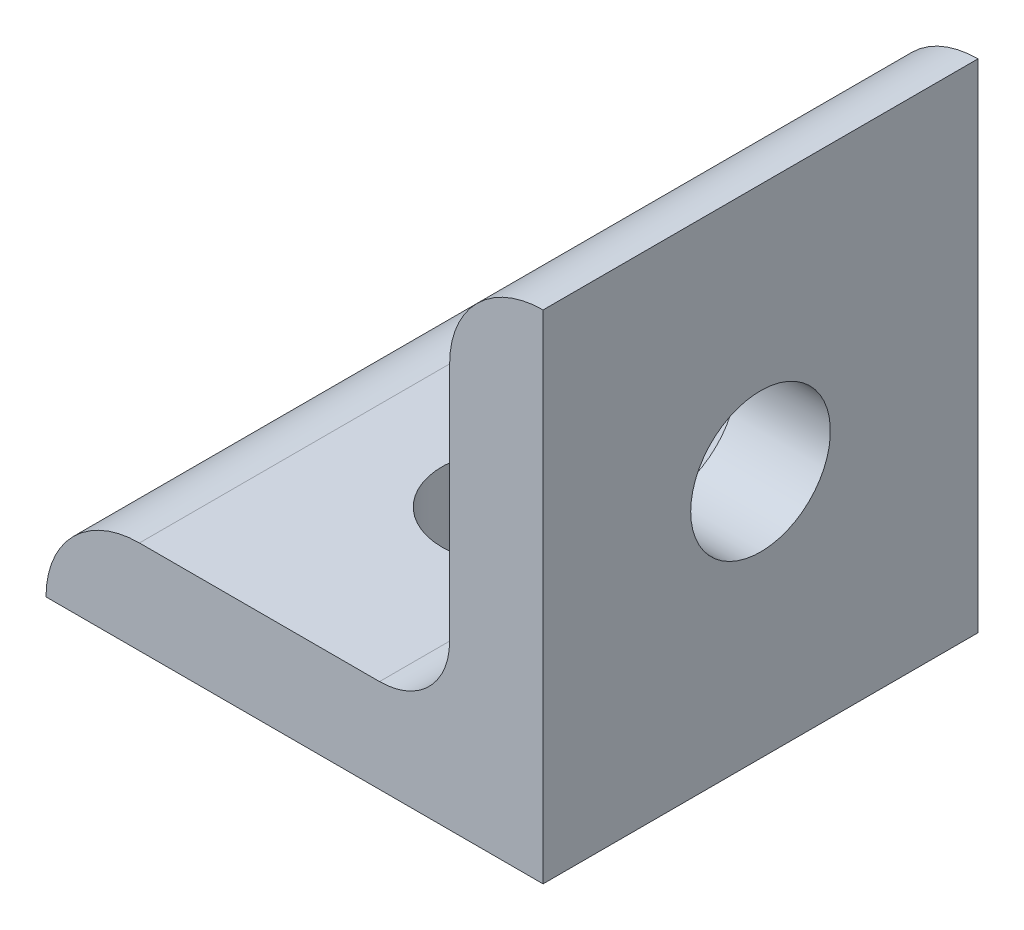
ISO-10303-21;
HEADER;
FILE_DESCRIPTION(('STEP AP214'),'2;1');
FILE_NAME('part.step','',(''),(''),'','','');
FILE_SCHEMA(('AUTOMOTIVE_DESIGN { 1 0 10303 214 1 1 1 1 }'));
ENDSEC;
DATA;
#1=APPLICATION_CONTEXT('core data for automotive mechanical design processes');
#2=APPLICATION_PROTOCOL_DEFINITION('international standard','automotive_design',2000,#1);
#3=PRODUCT_CONTEXT('',#1,'mechanical');
#4=PRODUCT('Part','Part','',(#3));
#5=PRODUCT_RELATED_PRODUCT_CATEGORY('part','',(#4));
#6=PRODUCT_DEFINITION_FORMATION('','',#4);
#7=PRODUCT_DEFINITION_CONTEXT('part definition',#1,'design');
#8=PRODUCT_DEFINITION('design','',#6,#7);
#9=PRODUCT_DEFINITION_SHAPE('','',#8);
#10=(LENGTH_UNIT() NAMED_UNIT(*) SI_UNIT(.MILLI.,.METRE.));
#11=(NAMED_UNIT(*) PLANE_ANGLE_UNIT() SI_UNIT($,.RADIAN.));
#12=(NAMED_UNIT(*) SI_UNIT($,.STERADIAN.) SOLID_ANGLE_UNIT());
#13=UNCERTAINTY_MEASURE_WITH_UNIT(LENGTH_MEASURE(1.E-05),#10,'distance_accuracy_value','');
#14=(GEOMETRIC_REPRESENTATION_CONTEXT(3) GLOBAL_UNCERTAINTY_ASSIGNED_CONTEXT((#13)) GLOBAL_UNIT_ASSIGNED_CONTEXT((#10,
#11,#12)) REPRESENTATION_CONTEXT('',''));
#15=CARTESIAN_POINT('',(0.,0.,0.));
#16=DIRECTION('',(0.,0.,1.));
#17=DIRECTION('',(1.,0.,0.));
#18=AXIS2_PLACEMENT_3D('',#15,#16,#17);
#19=CARTESIAN_POINT('',(0.,0.,-11.1125));
#20=DIRECTION('',(0.,-1.,0.));
#21=DIRECTION('',(1.,0.,0.));
#22=AXIS2_PLACEMENT_3D('',#19,#20,#21);
#23=PLANE('',#22);
#24=CARTESIAN_POINT('',(-12.7,0.,0.));
#25=DIRECTION('',(0.,1.,0.));
#26=DIRECTION('',(0.,0.,1.));
#27=AXIS2_PLACEMENT_3D('',#24,#25,#26);
#28=CIRCLE('',#27,3.5687);
#29=CARTESIAN_POINT('',(-12.7,0.,3.5687));
#30=VERTEX_POINT('',#29);
#31=EDGE_CURVE('E127',#30,#30,#28,.T.);
#32=ORIENTED_EDGE('',*,*,#31,.T.);
#33=EDGE_LOOP('',(#32));
#34=FACE_BOUND('',#33,.T.);
#35=DIRECTION('',(1.,0.,0.));
#36=VECTOR('',#35,1.);
#37=CARTESIAN_POINT('',(0.,0.,11.1125));
#38=LINE('',#37,#36);
#39=CARTESIAN_POINT('',(-25.4,0.,11.1125));
#40=VERTEX_POINT('',#39);
#41=CARTESIAN_POINT('',(0.,0.,11.1125));
#42=VERTEX_POINT('',#41);
#43=EDGE_CURVE('E123',#40,#42,#38,.T.);
#44=ORIENTED_EDGE('',*,*,#43,.F.);
#45=DIRECTION('',(0.,0.,1.));
#46=VECTOR('',#45,1.);
#47=CARTESIAN_POINT('',(-25.4,0.,-11.1125));
#48=LINE('',#47,#46);
#49=CARTESIAN_POINT('',(-25.4,0.,-11.1125));
#50=VERTEX_POINT('',#49);
#51=EDGE_CURVE('E11',#50,#40,#48,.T.);
#52=ORIENTED_EDGE('',*,*,#51,.F.);
#53=DIRECTION('',(1.,0.,0.));
#54=VECTOR('',#53,1.);
#55=CARTESIAN_POINT('',(0.,0.,-11.1125));
#56=LINE('',#55,#54);
#57=CARTESIAN_POINT('',(0.,0.,-11.1125));
#58=VERTEX_POINT('',#57);
#59=EDGE_CURVE('E141',#50,#58,#56,.T.);
#60=ORIENTED_EDGE('',*,*,#59,.T.);
#61=DIRECTION('',(0.,0.,1.));
#62=VECTOR('',#61,1.);
#63=CARTESIAN_POINT('',(0.,0.,-11.1125));
#64=LINE('',#63,#62);
#65=EDGE_CURVE('E35',#58,#42,#64,.T.);
#66=ORIENTED_EDGE('',*,*,#65,.T.);
#67=EDGE_LOOP('',(#44,#52,#60,#66));
#68=FACE_BOUND('',#67,.T.);
#69=ADVANCED_FACE('F32',(#34,#68),#23,.T.);
#70=CARTESIAN_POINT('',(-20.6248,0.,-11.1125));
#71=DIRECTION('',(0.,0.,1.));
#72=DIRECTION('',(1.,0.,0.));
#73=AXIS2_PLACEMENT_3D('',#70,#71,#72);
#74=CYLINDRICAL_SURFACE('',#73,4.7752);
#75=CARTESIAN_POINT('',(-20.6248,0.,11.1125));
#76=DIRECTION('',(0.,0.,1.));
#77=DIRECTION('',(-1.,0.,0.));
#78=AXIS2_PLACEMENT_3D('',#75,#76,#77);
#79=CIRCLE('',#78,4.7752);
#80=CARTESIAN_POINT('',(-20.6248,4.7752,11.1125));
#81=VERTEX_POINT('',#80);
#82=EDGE_CURVE('E139',#81,#40,#79,.T.);
#83=ORIENTED_EDGE('',*,*,#82,.F.);
#84=DIRECTION('',(0.,0.,1.));
#85=VECTOR('',#84,1.);
#86=CARTESIAN_POINT('',(-20.6248,4.7752,-11.1125));
#87=LINE('',#86,#85);
#88=CARTESIAN_POINT('',(-20.6248,4.7752,-11.1125));
#89=VERTEX_POINT('',#88);
#90=EDGE_CURVE('E41',#89,#81,#87,.T.);
#91=ORIENTED_EDGE('',*,*,#90,.F.);
#92=CARTESIAN_POINT('',(-20.6248,0.,-11.1125));
#93=DIRECTION('',(0.,0.,1.));
#94=DIRECTION('',(-1.,0.,0.));
#95=AXIS2_PLACEMENT_3D('',#92,#93,#94);
#96=CIRCLE('',#95,4.7752);
#97=EDGE_CURVE('E113',#89,#50,#96,.T.);
#98=ORIENTED_EDGE('',*,*,#97,.T.);
#99=ORIENTED_EDGE('',*,*,#51,.T.);
#100=EDGE_LOOP('',(#83,#91,#98,#99));
#101=FACE_BOUND('',#100,.T.);
#102=ADVANCED_FACE('F151',(#101),#74,.T.);
#103=CARTESIAN_POINT('',(-20.6248,4.7752,-11.1125));
#104=DIRECTION('',(0.,1.,0.));
#105=DIRECTION('',(-1.,0.,0.));
#106=AXIS2_PLACEMENT_3D('',#103,#104,#105);
#107=PLANE('',#106);
#108=CARTESIAN_POINT('',(-12.7,4.77519999999999,0.));
#109=DIRECTION('',(0.,1.,0.));
#110=DIRECTION('',(0.,0.,1.));
#111=AXIS2_PLACEMENT_3D('',#108,#109,#110);
#112=CIRCLE('',#111,3.5687);
#113=CARTESIAN_POINT('',(-12.7,4.77519999999999,3.5687));
#114=VERTEX_POINT('',#113);
#115=EDGE_CURVE('E182',#114,#114,#112,.T.);
#116=ORIENTED_EDGE('',*,*,#115,.F.);
#117=EDGE_LOOP('',(#116));
#118=FACE_BOUND('',#117,.T.);
#119=DIRECTION('',(-1.,0.,0.));
#120=VECTOR('',#119,1.);
#121=CARTESIAN_POINT('',(-20.6248,4.7752,11.1125));
#122=LINE('',#121,#120);
#123=CARTESIAN_POINT('',(-8.3566,4.7752,11.1125));
#124=VERTEX_POINT('',#123);
#125=EDGE_CURVE('E100',#124,#81,#122,.T.);
#126=ORIENTED_EDGE('',*,*,#125,.F.);
#127=DIRECTION('',(0.,0.,1.));
#128=VECTOR('',#127,1.);
#129=CARTESIAN_POINT('',(-8.3566,4.7752,-11.1125));
#130=LINE('',#129,#128);
#131=CARTESIAN_POINT('',(-8.3566,4.7752,-11.1125));
#132=VERTEX_POINT('',#131);
#133=EDGE_CURVE('E95',#132,#124,#130,.T.);
#134=ORIENTED_EDGE('',*,*,#133,.F.);
#135=DIRECTION('',(-1.,0.,0.));
#136=VECTOR('',#135,1.);
#137=CARTESIAN_POINT('',(-20.6248,4.7752,-11.1125));
#138=LINE('',#137,#136);
#139=EDGE_CURVE('E98',#132,#89,#138,.T.);
#140=ORIENTED_EDGE('',*,*,#139,.T.);
#141=ORIENTED_EDGE('',*,*,#90,.T.);
#142=EDGE_LOOP('',(#126,#134,#140,#141));
#143=FACE_BOUND('',#142,.T.);
#144=ADVANCED_FACE('F97',(#118,#143),#107,.T.);
#145=CARTESIAN_POINT('',(-8.3566,8.35659999999999,-11.1125));
#146=DIRECTION('',(0.,0.,1.));
#147=DIRECTION('',(1.,0.,0.));
#148=AXIS2_PLACEMENT_3D('',#145,#146,#147);
#149=CYLINDRICAL_SURFACE('',#148,3.5814);
#150=CARTESIAN_POINT('',(-8.3566,8.35659999999999,11.1125));
#151=DIRECTION('',(0.,0.,-1.));
#152=DIRECTION('',(1.,0.,0.));
#153=AXIS2_PLACEMENT_3D('',#150,#151,#152);
#154=CIRCLE('',#153,3.5814);
#155=CARTESIAN_POINT('',(-4.7752,8.35659999999999,11.1125));
#156=VERTEX_POINT('',#155);
#157=EDGE_CURVE('E136',#156,#124,#154,.T.);
#158=ORIENTED_EDGE('',*,*,#157,.F.);
#159=DIRECTION('',(0.,0.,1.));
#160=VECTOR('',#159,1.);
#161=CARTESIAN_POINT('',(-4.7752,8.35659999999999,-11.1125));
#162=LINE('',#161,#160);
#163=CARTESIAN_POINT('',(-4.7752,8.35659999999999,-11.1125));
#164=VERTEX_POINT('',#163);
#165=EDGE_CURVE('E105',#164,#156,#162,.T.);
#166=ORIENTED_EDGE('',*,*,#165,.F.);
#167=CARTESIAN_POINT('',(-8.3566,8.35659999999999,-11.1125));
#168=DIRECTION('',(0.,0.,-1.));
#169=DIRECTION('',(1.,0.,0.));
#170=AXIS2_PLACEMENT_3D('',#167,#168,#169);
#171=CIRCLE('',#170,3.5814);
#172=EDGE_CURVE('E111',#164,#132,#171,.T.);
#173=ORIENTED_EDGE('',*,*,#172,.T.);
#174=ORIENTED_EDGE('',*,*,#133,.T.);
#175=EDGE_LOOP('',(#158,#166,#173,#174));
#176=FACE_BOUND('',#175,.T.);
#177=ADVANCED_FACE('F115',(#176),#149,.F.);
#178=CARTESIAN_POINT('',(-4.7752,8.35659999999999,-11.1125));
#179=DIRECTION('',(-1.,0.,0.));
#180=DIRECTION('',(0.,0.,1.));
#181=AXIS2_PLACEMENT_3D('',#178,#179,#180);
#182=PLANE('',#181);
#183=CARTESIAN_POINT('',(-4.7752,12.7,0.));
#184=DIRECTION('',(-1.,0.,0.));
#185=DIRECTION('',(0.,0.,1.));
#186=AXIS2_PLACEMENT_3D('',#183,#184,#185);
#187=CIRCLE('',#186,3.5687);
#188=CARTESIAN_POINT('',(-4.7752,12.7,3.5687));
#189=VERTEX_POINT('',#188);
#190=EDGE_CURVE('E183',#189,#189,#187,.T.);
#191=ORIENTED_EDGE('',*,*,#190,.F.);
#192=EDGE_LOOP('',(#191));
#193=FACE_BOUND('',#192,.T.);
#194=DIRECTION('',(0.,-1.,0.));
#195=VECTOR('',#194,1.);
#196=CARTESIAN_POINT('',(-4.7752,8.35659999999999,11.1125));
#197=LINE('',#196,#195);
#198=CARTESIAN_POINT('',(-4.7752,20.6248,11.1125));
#199=VERTEX_POINT('',#198);
#200=EDGE_CURVE('E133',#199,#156,#197,.T.);
#201=ORIENTED_EDGE('',*,*,#200,.F.);
#202=DIRECTION('',(0.,0.,1.));
#203=VECTOR('',#202,1.);
#204=CARTESIAN_POINT('',(-4.7752,20.6248,-11.1125));
#205=LINE('',#204,#203);
#206=CARTESIAN_POINT('',(-4.7752,20.6248,-11.1125));
#207=VERTEX_POINT('',#206);
#208=EDGE_CURVE('E145',#207,#199,#205,.T.);
#209=ORIENTED_EDGE('',*,*,#208,.F.);
#210=DIRECTION('',(0.,-1.,0.));
#211=VECTOR('',#210,1.);
#212=CARTESIAN_POINT('',(-4.7752,8.35659999999999,-11.1125));
#213=LINE('',#212,#211);
#214=EDGE_CURVE('E116',#207,#164,#213,.T.);
#215=ORIENTED_EDGE('',*,*,#214,.T.);
#216=ORIENTED_EDGE('',*,*,#165,.T.);
#217=EDGE_LOOP('',(#201,#209,#215,#216));
#218=FACE_BOUND('',#217,.T.);
#219=ADVANCED_FACE('F166',(#193,#218),#182,.T.);
#220=CARTESIAN_POINT('',(0.,20.6248,-11.1125));
#221=DIRECTION('',(0.,0.,1.));
#222=DIRECTION('',(1.,0.,0.));
#223=AXIS2_PLACEMENT_3D('',#220,#221,#222);
#224=CYLINDRICAL_SURFACE('',#223,4.7752);
#225=CARTESIAN_POINT('',(0.,20.6248,11.1125));
#226=DIRECTION('',(0.,0.,1.));
#227=DIRECTION('',(-1.,0.,0.));
#228=AXIS2_PLACEMENT_3D('',#225,#226,#227);
#229=CIRCLE('',#228,4.7752);
#230=CARTESIAN_POINT('',(0.,25.4,11.1125));
#231=VERTEX_POINT('',#230);
#232=EDGE_CURVE('E130',#231,#199,#229,.T.);
#233=ORIENTED_EDGE('',*,*,#232,.F.);
#234=DIRECTION('',(0.,0.,1.));
#235=VECTOR('',#234,1.);
#236=CARTESIAN_POINT('',(0.,25.4,-11.1125));
#237=LINE('',#236,#235);
#238=CARTESIAN_POINT('',(0.,25.4,-11.1125));
#239=VERTEX_POINT('',#238);
#240=EDGE_CURVE('E146',#239,#231,#237,.T.);
#241=ORIENTED_EDGE('',*,*,#240,.F.);
#242=CARTESIAN_POINT('',(0.,20.6248,-11.1125));
#243=DIRECTION('',(0.,0.,1.));
#244=DIRECTION('',(-1.,0.,0.));
#245=AXIS2_PLACEMENT_3D('',#242,#243,#244);
#246=CIRCLE('',#245,4.7752);
#247=EDGE_CURVE('E118',#239,#207,#246,.T.);
#248=ORIENTED_EDGE('',*,*,#247,.T.);
#249=ORIENTED_EDGE('',*,*,#208,.T.);
#250=EDGE_LOOP('',(#233,#241,#248,#249));
#251=FACE_BOUND('',#250,.T.);
#252=ADVANCED_FACE('F169',(#251),#224,.T.);
#253=CARTESIAN_POINT('',(0.,0.,-11.1125));
#254=DIRECTION('',(1.,0.,0.));
#255=DIRECTION('',(0.,0.,-1.));
#256=AXIS2_PLACEMENT_3D('',#253,#254,#255);
#257=PLANE('',#256);
#258=CARTESIAN_POINT('',(0.,12.7,0.));
#259=DIRECTION('',(-1.,0.,0.));
#260=DIRECTION('',(0.,0.,1.));
#261=AXIS2_PLACEMENT_3D('',#258,#259,#260);
#262=CIRCLE('',#261,3.5687);
#263=CARTESIAN_POINT('',(0.,12.7,3.5687));
#264=VERTEX_POINT('',#263);
#265=EDGE_CURVE('E180',#264,#264,#262,.T.);
#266=ORIENTED_EDGE('',*,*,#265,.T.);
#267=EDGE_LOOP('',(#266));
#268=FACE_BOUND('',#267,.T.);
#269=DIRECTION('',(0.,1.,0.));
#270=VECTOR('',#269,1.);
#271=CARTESIAN_POINT('',(0.,0.,11.1125));
#272=LINE('',#271,#270);
#273=EDGE_CURVE('E126',#42,#231,#272,.T.);
#274=ORIENTED_EDGE('',*,*,#273,.F.);
#275=ORIENTED_EDGE('',*,*,#65,.F.);
#276=DIRECTION('',(0.,1.,0.));
#277=VECTOR('',#276,1.);
#278=CARTESIAN_POINT('',(0.,0.,-11.1125));
#279=LINE('',#278,#277);
#280=EDGE_CURVE('E193',#58,#239,#279,.T.);
#281=ORIENTED_EDGE('',*,*,#280,.T.);
#282=ORIENTED_EDGE('',*,*,#240,.T.);
#283=EDGE_LOOP('',(#274,#275,#281,#282));
#284=FACE_BOUND('',#283,.T.);
#285=ADVANCED_FACE('F148',(#268,#284),#257,.T.);
#286=CARTESIAN_POINT('',(-20.6248,0.,-11.1125));
#287=DIRECTION('',(0.,0.,-1.));
#288=DIRECTION('',(-1.,0.,0.));
#289=AXIS2_PLACEMENT_3D('',#286,#287,#288);
#290=PLANE('',#289);
#291=ORIENTED_EDGE('',*,*,#59,.F.);
#292=ORIENTED_EDGE('',*,*,#97,.F.);
#293=ORIENTED_EDGE('',*,*,#139,.F.);
#294=ORIENTED_EDGE('',*,*,#172,.F.);
#295=ORIENTED_EDGE('',*,*,#214,.F.);
#296=ORIENTED_EDGE('',*,*,#247,.F.);
#297=ORIENTED_EDGE('',*,*,#280,.F.);
#298=EDGE_LOOP('',(#291,#292,#293,#294,#295,#296,#297));
#299=FACE_BOUND('',#298,.T.);
#300=ADVANCED_FACE('F109',(#299),#290,.T.);
#301=CARTESIAN_POINT('',(-20.6248,0.,11.1125));
#302=DIRECTION('',(0.,0.,-1.));
#303=DIRECTION('',(-1.,0.,0.));
#304=AXIS2_PLACEMENT_3D('',#301,#302,#303);
#305=PLANE('',#304);
#306=ORIENTED_EDGE('',*,*,#43,.T.);
#307=ORIENTED_EDGE('',*,*,#273,.T.);
#308=ORIENTED_EDGE('',*,*,#232,.T.);
#309=ORIENTED_EDGE('',*,*,#200,.T.);
#310=ORIENTED_EDGE('',*,*,#157,.T.);
#311=ORIENTED_EDGE('',*,*,#125,.T.);
#312=ORIENTED_EDGE('',*,*,#82,.T.);
#313=EDGE_LOOP('',(#306,#307,#308,#309,#310,#311,#312));
#314=FACE_BOUND('',#313,.T.);
#315=ADVANCED_FACE('F150',(#314),#305,.F.);
#316=CARTESIAN_POINT('',(-12.7,0.,0.));
#317=DIRECTION('',(0.,1.,0.));
#318=DIRECTION('',(0.,0.,1.));
#319=AXIS2_PLACEMENT_3D('',#316,#317,#318);
#320=CYLINDRICAL_SURFACE('',#319,3.5687);
#321=ORIENTED_EDGE('',*,*,#31,.F.);
#322=EDGE_LOOP('',(#321));
#323=FACE_BOUND('',#322,.T.);
#324=ORIENTED_EDGE('',*,*,#115,.T.);
#325=EDGE_LOOP('',(#324));
#326=FACE_BOUND('',#325,.T.);
#327=ADVANCED_FACE('F200',(#323,#326),#320,.F.);
#328=CARTESIAN_POINT('',(0.,12.7,0.));
#329=DIRECTION('',(-1.,0.,0.));
#330=DIRECTION('',(0.,0.,1.));
#331=AXIS2_PLACEMENT_3D('',#328,#329,#330);
#332=CYLINDRICAL_SURFACE('',#331,3.5687);
#333=ORIENTED_EDGE('',*,*,#265,.F.);
#334=EDGE_LOOP('',(#333));
#335=FACE_BOUND('',#334,.T.);
#336=ORIENTED_EDGE('',*,*,#190,.T.);
#337=EDGE_LOOP('',(#336));
#338=FACE_BOUND('',#337,.T.);
#339=ADVANCED_FACE('F203',(#335,#338),#332,.F.);
#340=CLOSED_SHELL('',(#69,#102,#144,#177,#219,#252,#285,#300,#315,#327,#339));
#341=MANIFOLD_SOLID_BREP('B2',#340);
#342=ADVANCED_BREP_SHAPE_REPRESENTATION('',(#18,#341),#14);
#343=SHAPE_DEFINITION_REPRESENTATION(#9,#342);
ENDSEC;
END-ISO-10303-21;
